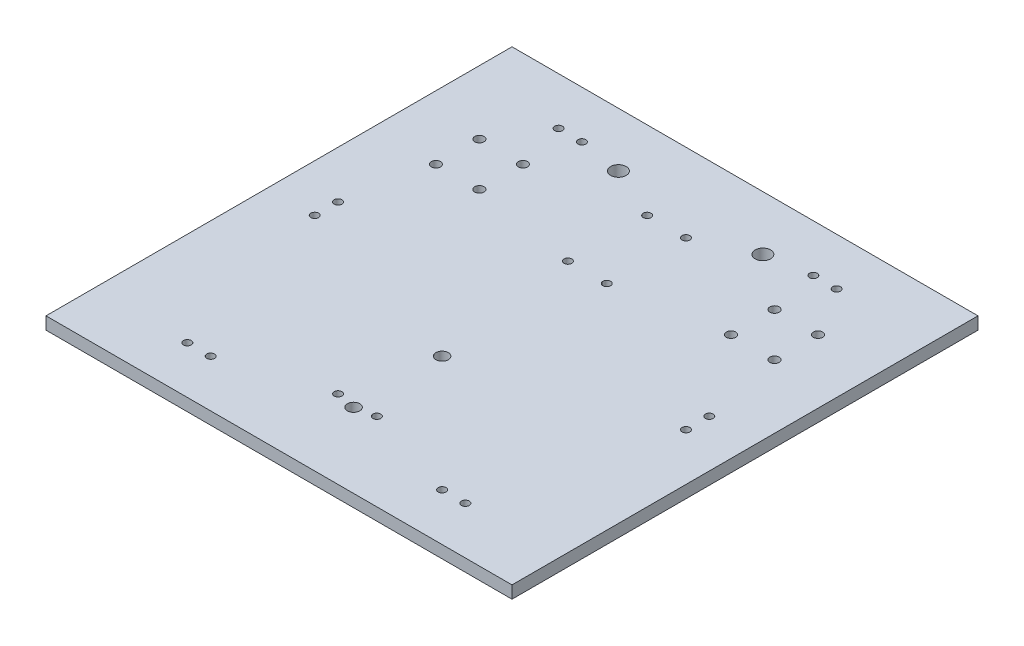
ISO-10303-21;
HEADER;
FILE_DESCRIPTION(('STEP AP214'),'2;1');
FILE_NAME('part.step','',(''),(''),'','','');
FILE_SCHEMA(('AUTOMOTIVE_DESIGN { 1 0 10303 214 1 1 1 1 }'));
ENDSEC;
DATA;
#1=APPLICATION_CONTEXT('core data for automotive mechanical design processes');
#2=APPLICATION_PROTOCOL_DEFINITION('international standard','automotive_design',2000,#1);
#3=PRODUCT_CONTEXT('',#1,'mechanical');
#4=PRODUCT('Part','Part','',(#3));
#5=PRODUCT_RELATED_PRODUCT_CATEGORY('part','',(#4));
#6=PRODUCT_DEFINITION_FORMATION('','',#4);
#7=PRODUCT_DEFINITION_CONTEXT('part definition',#1,'design');
#8=PRODUCT_DEFINITION('design','',#6,#7);
#9=PRODUCT_DEFINITION_SHAPE('','',#8);
#10=(LENGTH_UNIT() NAMED_UNIT(*) SI_UNIT(.MILLI.,.METRE.));
#11=(NAMED_UNIT(*) PLANE_ANGLE_UNIT() SI_UNIT($,.RADIAN.));
#12=(NAMED_UNIT(*) SI_UNIT($,.STERADIAN.) SOLID_ANGLE_UNIT());
#13=UNCERTAINTY_MEASURE_WITH_UNIT(LENGTH_MEASURE(1.E-05),#10,'distance_accuracy_value','');
#14=(GEOMETRIC_REPRESENTATION_CONTEXT(3) GLOBAL_UNCERTAINTY_ASSIGNED_CONTEXT((#13)) GLOBAL_UNIT_ASSIGNED_CONTEXT((#10,
#11,#12)) REPRESENTATION_CONTEXT('',''));
#15=CARTESIAN_POINT('',(0.,0.,0.));
#16=DIRECTION('',(0.,0.,1.));
#17=DIRECTION('',(1.,0.,0.));
#18=AXIS2_PLACEMENT_3D('',#15,#16,#17);
#19=CARTESIAN_POINT('',(-150.,8.,150.));
#20=DIRECTION('',(1.,0.,0.));
#21=DIRECTION('',(0.,0.,-1.));
#22=AXIS2_PLACEMENT_3D('',#19,#20,#21);
#23=PLANE('',#22);
#24=DIRECTION('',(0.,0.,1.));
#25=VECTOR('',#24,1.);
#26=CARTESIAN_POINT('',(-150.,0.,150.));
#27=LINE('',#26,#25);
#28=CARTESIAN_POINT('',(-150.,0.,-150.));
#29=VERTEX_POINT('',#28);
#30=CARTESIAN_POINT('',(-150.,0.,150.));
#31=VERTEX_POINT('',#30);
#32=EDGE_CURVE('E102',#29,#31,#27,.T.);
#33=ORIENTED_EDGE('',*,*,#32,.T.);
#34=DIRECTION('',(0.,-1.,0.));
#35=VECTOR('',#34,1.);
#36=CARTESIAN_POINT('',(-150.,8.,150.));
#37=LINE('',#36,#35);
#38=CARTESIAN_POINT('',(-150.,8.,150.));
#39=VERTEX_POINT('',#38);
#40=EDGE_CURVE('E11',#39,#31,#37,.T.);
#41=ORIENTED_EDGE('',*,*,#40,.F.);
#42=DIRECTION('',(0.,0.,1.));
#43=VECTOR('',#42,1.);
#44=CARTESIAN_POINT('',(-150.,8.,150.));
#45=LINE('',#44,#43);
#46=CARTESIAN_POINT('',(-150.,8.,-150.));
#47=VERTEX_POINT('',#46);
#48=EDGE_CURVE('E89',#47,#39,#45,.T.);
#49=ORIENTED_EDGE('',*,*,#48,.F.);
#50=DIRECTION('',(0.,-1.,0.));
#51=VECTOR('',#50,1.);
#52=CARTESIAN_POINT('',(-150.,8.,-150.));
#53=LINE('',#52,#51);
#54=EDGE_CURVE('E98',#47,#29,#53,.T.);
#55=ORIENTED_EDGE('',*,*,#54,.T.);
#56=EDGE_LOOP('',(#33,#41,#49,#55));
#57=FACE_BOUND('',#56,.T.);
#58=ADVANCED_FACE('F36',(#57),#23,.F.);
#59=CARTESIAN_POINT('',(150.,8.,150.));
#60=DIRECTION('',(0.,0.,-1.));
#61=DIRECTION('',(-1.,0.,0.));
#62=AXIS2_PLACEMENT_3D('',#59,#60,#61);
#63=PLANE('',#62);
#64=DIRECTION('',(1.,0.,0.));
#65=VECTOR('',#64,1.);
#66=CARTESIAN_POINT('',(150.,0.,150.));
#67=LINE('',#66,#65);
#68=CARTESIAN_POINT('',(150.,0.,150.));
#69=VERTEX_POINT('',#68);
#70=EDGE_CURVE('E93',#31,#69,#67,.T.);
#71=ORIENTED_EDGE('',*,*,#70,.T.);
#72=DIRECTION('',(0.,-1.,0.));
#73=VECTOR('',#72,1.);
#74=CARTESIAN_POINT('',(150.,8.,150.));
#75=LINE('',#74,#73);
#76=CARTESIAN_POINT('',(150.,8.,150.));
#77=VERTEX_POINT('',#76);
#78=EDGE_CURVE('E45',#77,#69,#75,.T.);
#79=ORIENTED_EDGE('',*,*,#78,.F.);
#80=DIRECTION('',(1.,0.,0.));
#81=VECTOR('',#80,1.);
#82=CARTESIAN_POINT('',(150.,8.,150.));
#83=LINE('',#82,#81);
#84=EDGE_CURVE('E84',#39,#77,#83,.T.);
#85=ORIENTED_EDGE('',*,*,#84,.F.);
#86=ORIENTED_EDGE('',*,*,#40,.T.);
#87=EDGE_LOOP('',(#71,#79,#85,#86));
#88=FACE_BOUND('',#87,.T.);
#89=ADVANCED_FACE('F92',(#88),#63,.F.);
#90=CARTESIAN_POINT('',(150.,8.,150.));
#91=DIRECTION('',(-1.,0.,0.));
#92=DIRECTION('',(0.,0.,1.));
#93=AXIS2_PLACEMENT_3D('',#90,#91,#92);
#94=PLANE('',#93);
#95=DIRECTION('',(0.,0.,-1.));
#96=VECTOR('',#95,1.);
#97=CARTESIAN_POINT('',(150.,0.,150.));
#98=LINE('',#97,#96);
#99=CARTESIAN_POINT('',(150.,0.,-150.));
#100=VERTEX_POINT('',#99);
#101=EDGE_CURVE('E71',#69,#100,#98,.T.);
#102=ORIENTED_EDGE('',*,*,#101,.T.);
#103=DIRECTION('',(0.,-1.,0.));
#104=VECTOR('',#103,1.);
#105=CARTESIAN_POINT('',(150.,8.,-150.));
#106=LINE('',#105,#104);
#107=CARTESIAN_POINT('',(150.,8.,-150.));
#108=VERTEX_POINT('',#107);
#109=EDGE_CURVE('E94',#108,#100,#106,.T.);
#110=ORIENTED_EDGE('',*,*,#109,.F.);
#111=DIRECTION('',(0.,0.,-1.));
#112=VECTOR('',#111,1.);
#113=CARTESIAN_POINT('',(150.,8.,150.));
#114=LINE('',#113,#112);
#115=EDGE_CURVE('E87',#77,#108,#114,.T.);
#116=ORIENTED_EDGE('',*,*,#115,.F.);
#117=ORIENTED_EDGE('',*,*,#78,.T.);
#118=EDGE_LOOP('',(#102,#110,#116,#117));
#119=FACE_BOUND('',#118,.T.);
#120=ADVANCED_FACE('F96',(#119),#94,.F.);
#121=CARTESIAN_POINT('',(150.,8.,-150.));
#122=DIRECTION('',(0.,0.,1.));
#123=DIRECTION('',(1.,0.,0.));
#124=AXIS2_PLACEMENT_3D('',#121,#122,#123);
#125=PLANE('',#124);
#126=DIRECTION('',(-1.,0.,0.));
#127=VECTOR('',#126,1.);
#128=CARTESIAN_POINT('',(150.,0.,-150.));
#129=LINE('',#128,#127);
#130=EDGE_CURVE('E77',#100,#29,#129,.T.);
#131=ORIENTED_EDGE('',*,*,#130,.T.);
#132=ORIENTED_EDGE('',*,*,#54,.F.);
#133=DIRECTION('',(-1.,0.,0.));
#134=VECTOR('',#133,1.);
#135=CARTESIAN_POINT('',(150.,8.,-150.));
#136=LINE('',#135,#134);
#137=EDGE_CURVE('E54',#108,#47,#136,.T.);
#138=ORIENTED_EDGE('',*,*,#137,.F.);
#139=ORIENTED_EDGE('',*,*,#109,.T.);
#140=EDGE_LOOP('',(#131,#132,#138,#139));
#141=FACE_BOUND('',#140,.T.);
#142=ADVANCED_FACE('F265',(#141),#125,.F.);
#143=CARTESIAN_POINT('',(0.,8.,0.));
#144=DIRECTION('',(0.,1.,0.));
#145=DIRECTION('',(0.,0.,1.));
#146=AXIS2_PLACEMENT_3D('',#143,#144,#145);
#147=PLANE('',#146);
#148=CARTESIAN_POINT('',(-12.5000000000002,8.,99.5));
#149=DIRECTION('',(0.,-1.,0.));
#150=DIRECTION('',(0.,0.,-1.));
#151=AXIS2_PLACEMENT_3D('',#148,#149,#150);
#152=CIRCLE('',#151,2.5);
#153=CARTESIAN_POINT('',(-12.5000000000002,8.,97.));
#154=VERTEX_POINT('',#153);
#155=EDGE_CURVE('E610',#154,#154,#152,.T.);
#156=ORIENTED_EDGE('',*,*,#155,.T.);
#157=EDGE_LOOP('',(#156));
#158=FACE_BOUND('',#157,.T.);
#159=CARTESIAN_POINT('',(12.4999999999999,8.,99.5));
#160=DIRECTION('',(0.,-1.,0.));
#161=DIRECTION('',(0.,0.,-1.));
#162=AXIS2_PLACEMENT_3D('',#159,#160,#161);
#163=CIRCLE('',#162,2.5);
#164=CARTESIAN_POINT('',(12.4999999999999,8.,97.));
#165=VERTEX_POINT('',#164);
#166=EDGE_CURVE('E612',#165,#165,#163,.T.);
#167=ORIENTED_EDGE('',*,*,#166,.T.);
#168=EDGE_LOOP('',(#167));
#169=FACE_BOUND('',#168,.T.);
#170=CARTESIAN_POINT('',(12.4999999999999,8.,-48.5));
#171=DIRECTION('',(0.,1.,0.));
#172=DIRECTION('',(0.,0.,1.));
#173=AXIS2_PLACEMENT_3D('',#170,#171,#172);
#174=CIRCLE('',#173,2.5);
#175=CARTESIAN_POINT('',(12.4999999999999,8.,-46.));
#176=VERTEX_POINT('',#175);
#177=EDGE_CURVE('E618',#176,#176,#174,.T.);
#178=ORIENTED_EDGE('',*,*,#177,.F.);
#179=EDGE_LOOP('',(#178));
#180=FACE_BOUND('',#179,.T.);
#181=CARTESIAN_POINT('',(-12.5000000000001,8.,-48.5));
#182=DIRECTION('',(0.,1.,0.));
#183=DIRECTION('',(0.,0.,1.));
#184=AXIS2_PLACEMENT_3D('',#181,#182,#183);
#185=CIRCLE('',#184,2.5);
#186=CARTESIAN_POINT('',(-12.5000000000001,8.,-46.));
#187=VERTEX_POINT('',#186);
#188=EDGE_CURVE('E624',#187,#187,#185,.T.);
#189=ORIENTED_EDGE('',*,*,#188,.F.);
#190=EDGE_LOOP('',(#189));
#191=FACE_BOUND('',#190,.T.);
#192=CARTESIAN_POINT('',(-12.5000000000002,8.,-99.5));
#193=DIRECTION('',(0.,1.,0.));
#194=DIRECTION('',(0.,0.,1.));
#195=AXIS2_PLACEMENT_3D('',#192,#193,#194);
#196=CIRCLE('',#195,2.5);
#197=CARTESIAN_POINT('',(-12.5000000000002,8.,-97.));
#198=VERTEX_POINT('',#197);
#199=EDGE_CURVE('E630',#198,#198,#196,.T.);
#200=ORIENTED_EDGE('',*,*,#199,.F.);
#201=EDGE_LOOP('',(#200));
#202=FACE_BOUND('',#201,.T.);
#203=CARTESIAN_POINT('',(12.4999999999999,8.,-99.5));
#204=DIRECTION('',(0.,1.,0.));
#205=DIRECTION('',(0.,0.,1.));
#206=AXIS2_PLACEMENT_3D('',#203,#204,#205);
#207=CIRCLE('',#206,2.5);
#208=CARTESIAN_POINT('',(12.4999999999999,8.,-97.));
#209=VERTEX_POINT('',#208);
#210=EDGE_CURVE('E636',#209,#209,#207,.T.);
#211=ORIENTED_EDGE('',*,*,#210,.F.);
#212=EDGE_LOOP('',(#211));
#213=FACE_BOUND('',#212,.T.);
#214=CARTESIAN_POINT('',(46.5,8.00000000000012,-115.));
#215=DIRECTION('',(0.,-1.,0.));
#216=DIRECTION('',(1.,0.,0.));
#217=AXIS2_PLACEMENT_3D('',#214,#215,#216);
#218=CIRCLE('',#217,5.);
#219=CARTESIAN_POINT('',(51.5,8.00000000000012,-115.));
#220=VERTEX_POINT('',#219);
#221=EDGE_CURVE('E165',#220,#220,#218,.T.);
#222=ORIENTED_EDGE('',*,*,#221,.T.);
#223=EDGE_LOOP('',(#222));
#224=FACE_BOUND('',#223,.T.);
#225=CARTESIAN_POINT('',(81.,8.0000000000001,-88.));
#226=DIRECTION('',(0.,-1.,0.));
#227=DIRECTION('',(0.,0.,-1.));
#228=AXIS2_PLACEMENT_3D('',#225,#226,#227);
#229=CIRCLE('',#228,3.00000000000001);
#230=CARTESIAN_POINT('',(81.,8.0000000000001,-91.));
#231=VERTEX_POINT('',#230);
#232=EDGE_CURVE('E155',#231,#231,#229,.T.);
#233=ORIENTED_EDGE('',*,*,#232,.T.);
#234=EDGE_LOOP('',(#233));
#235=FACE_BOUND('',#234,.T.);
#236=CARTESIAN_POINT('',(109.,8.0000000000001,-88.));
#237=DIRECTION('',(0.,-1.,0.));
#238=DIRECTION('',(0.,0.,-1.));
#239=AXIS2_PLACEMENT_3D('',#236,#237,#238);
#240=CIRCLE('',#239,3.00000000000001);
#241=CARTESIAN_POINT('',(109.,8.0000000000001,-91.));
#242=VERTEX_POINT('',#241);
#243=EDGE_CURVE('E152',#242,#242,#240,.T.);
#244=ORIENTED_EDGE('',*,*,#243,.T.);
#245=EDGE_LOOP('',(#244));
#246=FACE_BOUND('',#245,.T.);
#247=CARTESIAN_POINT('',(81.,8.0000000000001,-60.0000000000001));
#248=DIRECTION('',(0.,-1.,0.));
#249=DIRECTION('',(0.,0.,-1.));
#250=AXIS2_PLACEMENT_3D('',#247,#248,#249);
#251=CIRCLE('',#250,3.00000000000001);
#252=CARTESIAN_POINT('',(81.,8.0000000000001,-63.0000000000001));
#253=VERTEX_POINT('',#252);
#254=EDGE_CURVE('E149',#253,#253,#251,.T.);
#255=ORIENTED_EDGE('',*,*,#254,.T.);
#256=EDGE_LOOP('',(#255));
#257=FACE_BOUND('',#256,.T.);
#258=CARTESIAN_POINT('',(109.,8.0000000000001,-60.));
#259=DIRECTION('',(0.,-1.,0.));
#260=DIRECTION('',(0.,0.,-1.));
#261=AXIS2_PLACEMENT_3D('',#258,#259,#260);
#262=CIRCLE('',#261,3.00000000000001);
#263=CARTESIAN_POINT('',(109.,8.0000000000001,-63.));
#264=VERTEX_POINT('',#263);
#265=EDGE_CURVE('E145',#264,#264,#262,.T.);
#266=ORIENTED_EDGE('',*,*,#265,.T.);
#267=EDGE_LOOP('',(#266));
#268=FACE_BOUND('',#267,.T.);
#269=CARTESIAN_POINT('',(119.5,8.,7.49999999999994));
#270=DIRECTION('',(0.,1.,0.));
#271=DIRECTION('',(0.,0.,1.));
#272=AXIS2_PLACEMENT_3D('',#269,#270,#271);
#273=CIRCLE('',#272,2.5);
#274=CARTESIAN_POINT('',(119.5,8.,9.99999999999994));
#275=VERTEX_POINT('',#274);
#276=EDGE_CURVE('E175',#275,#275,#273,.T.);
#277=ORIENTED_EDGE('',*,*,#276,.F.);
#278=EDGE_LOOP('',(#277));
#279=FACE_BOUND('',#278,.T.);
#280=CARTESIAN_POINT('',(119.5,8.,-7.50000000000005));
#281=DIRECTION('',(0.,1.,0.));
#282=DIRECTION('',(0.,0.,1.));
#283=AXIS2_PLACEMENT_3D('',#280,#281,#282);
#284=CIRCLE('',#283,2.5);
#285=CARTESIAN_POINT('',(119.5,8.,-5.00000000000006));
#286=VERTEX_POINT('',#285);
#287=EDGE_CURVE('E181',#286,#286,#284,.T.);
#288=ORIENTED_EDGE('',*,*,#287,.F.);
#289=EDGE_LOOP('',(#288));
#290=FACE_BOUND('',#289,.T.);
#291=CARTESIAN_POINT('',(74.4999999999999,8.,119.5));
#292=DIRECTION('',(0.,1.,0.));
#293=DIRECTION('',(0.,0.,1.));
#294=AXIS2_PLACEMENT_3D('',#291,#292,#293);
#295=CIRCLE('',#294,2.5);
#296=CARTESIAN_POINT('',(74.4999999999999,8.,122.));
#297=VERTEX_POINT('',#296);
#298=EDGE_CURVE('E187',#297,#297,#295,.T.);
#299=ORIENTED_EDGE('',*,*,#298,.F.);
#300=EDGE_LOOP('',(#299));
#301=FACE_BOUND('',#300,.T.);
#302=CARTESIAN_POINT('',(89.4999999999999,8.,119.5));
#303=DIRECTION('',(0.,1.,0.));
#304=DIRECTION('',(0.,0.,1.));
#305=AXIS2_PLACEMENT_3D('',#302,#303,#304);
#306=CIRCLE('',#305,2.50000000000001);
#307=CARTESIAN_POINT('',(89.4999999999999,8.,122.));
#308=VERTEX_POINT('',#307);
#309=EDGE_CURVE('E193',#308,#308,#306,.T.);
#310=ORIENTED_EDGE('',*,*,#309,.F.);
#311=EDGE_LOOP('',(#310));
#312=FACE_BOUND('',#311,.T.);
#313=CARTESIAN_POINT('',(74.4999999999998,8.,-119.5));
#314=DIRECTION('',(0.,1.,0.));
#315=DIRECTION('',(0.,0.,1.));
#316=AXIS2_PLACEMENT_3D('',#313,#314,#315);
#317=CIRCLE('',#316,2.5);
#318=CARTESIAN_POINT('',(74.4999999999998,8.,-117.));
#319=VERTEX_POINT('',#318);
#320=EDGE_CURVE('E199',#319,#319,#317,.T.);
#321=ORIENTED_EDGE('',*,*,#320,.F.);
#322=EDGE_LOOP('',(#321));
#323=FACE_BOUND('',#322,.T.);
#324=CARTESIAN_POINT('',(89.4999999999998,8.,-119.5));
#325=DIRECTION('',(0.,1.,0.));
#326=DIRECTION('',(0.,0.,1.));
#327=AXIS2_PLACEMENT_3D('',#324,#325,#326);
#328=CIRCLE('',#327,2.50000000000001);
#329=CARTESIAN_POINT('',(89.4999999999998,8.,-117.));
#330=VERTEX_POINT('',#329);
#331=EDGE_CURVE('E205',#330,#330,#328,.T.);
#332=ORIENTED_EDGE('',*,*,#331,.F.);
#333=EDGE_LOOP('',(#332));
#334=FACE_BOUND('',#333,.T.);
#335=CARTESIAN_POINT('',(-74.5,8.,119.5));
#336=DIRECTION('',(0.,1.,0.));
#337=DIRECTION('',(0.,0.,1.));
#338=AXIS2_PLACEMENT_3D('',#335,#336,#337);
#339=CIRCLE('',#338,2.50000000000001);
#340=CARTESIAN_POINT('',(-74.5,8.,122.));
#341=VERTEX_POINT('',#340);
#342=EDGE_CURVE('E211',#341,#341,#339,.T.);
#343=ORIENTED_EDGE('',*,*,#342,.F.);
#344=EDGE_LOOP('',(#343));
#345=FACE_BOUND('',#344,.T.);
#346=CARTESIAN_POINT('',(-89.5,8.,119.5));
#347=DIRECTION('',(0.,1.,0.));
#348=DIRECTION('',(0.,0.,1.));
#349=AXIS2_PLACEMENT_3D('',#346,#347,#348);
#350=CIRCLE('',#349,2.5);
#351=CARTESIAN_POINT('',(-89.5,8.,122.));
#352=VERTEX_POINT('',#351);
#353=EDGE_CURVE('E140',#352,#352,#350,.T.);
#354=ORIENTED_EDGE('',*,*,#353,.F.);
#355=EDGE_LOOP('',(#354));
#356=FACE_BOUND('',#355,.T.);
#357=CARTESIAN_POINT('',(0.,8.,102.));
#358=DIRECTION('',(0.,1.,0.));
#359=DIRECTION('',(0.,0.,1.));
#360=AXIS2_PLACEMENT_3D('',#357,#358,#359);
#361=CIRCLE('',#360,4.);
#362=CARTESIAN_POINT('',(0.,8.,106.));
#363=VERTEX_POINT('',#362);
#364=EDGE_CURVE('E136',#363,#363,#361,.F.);
#365=ORIENTED_EDGE('',*,*,#364,.T.);
#366=EDGE_LOOP('',(#365));
#367=FACE_BOUND('',#366,.T.);
#368=CARTESIAN_POINT('',(0.,8.,45.));
#369=DIRECTION('',(0.,1.,0.));
#370=DIRECTION('',(0.,0.,1.));
#371=AXIS2_PLACEMENT_3D('',#368,#369,#370);
#372=CIRCLE('',#371,4.);
#373=CARTESIAN_POINT('',(0.,8.,49.));
#374=VERTEX_POINT('',#373);
#375=EDGE_CURVE('E135',#374,#374,#372,.F.);
#376=ORIENTED_EDGE('',*,*,#375,.T.);
#377=EDGE_LOOP('',(#376));
#378=FACE_BOUND('',#377,.T.);
#379=CARTESIAN_POINT('',(-46.5,8.0000000000001,-115.));
#380=DIRECTION('',(0.,-1.,0.));
#381=DIRECTION('',(0.,0.,-1.));
#382=AXIS2_PLACEMENT_3D('',#379,#380,#381);
#383=CIRCLE('',#382,5.);
#384=CARTESIAN_POINT('',(-46.5,8.00000000000011,-120.));
#385=VERTEX_POINT('',#384);
#386=EDGE_CURVE('E131',#385,#385,#383,.T.);
#387=ORIENTED_EDGE('',*,*,#386,.T.);
#388=EDGE_LOOP('',(#387));
#389=FACE_BOUND('',#388,.T.);
#390=CARTESIAN_POINT('',(-81.,8.,-60.));
#391=DIRECTION('',(0.,-1.,0.));
#392=DIRECTION('',(0.,0.,-1.));
#393=AXIS2_PLACEMENT_3D('',#390,#391,#392);
#394=CIRCLE('',#393,3.00000000000001);
#395=CARTESIAN_POINT('',(-81.,8.,-63.));
#396=VERTEX_POINT('',#395);
#397=EDGE_CURVE('E127',#396,#396,#394,.T.);
#398=ORIENTED_EDGE('',*,*,#397,.T.);
#399=EDGE_LOOP('',(#398));
#400=FACE_BOUND('',#399,.T.);
#401=CARTESIAN_POINT('',(-81.,8.,-88.));
#402=DIRECTION('',(0.,-1.,0.));
#403=DIRECTION('',(0.,0.,-1.));
#404=AXIS2_PLACEMENT_3D('',#401,#402,#403);
#405=CIRCLE('',#404,3.00000000000001);
#406=CARTESIAN_POINT('',(-81.,8.,-91.));
#407=VERTEX_POINT('',#406);
#408=EDGE_CURVE('E123',#407,#407,#405,.T.);
#409=ORIENTED_EDGE('',*,*,#408,.T.);
#410=EDGE_LOOP('',(#409));
#411=FACE_BOUND('',#410,.T.);
#412=CARTESIAN_POINT('',(-109.,8.,-60.0000000000001));
#413=DIRECTION('',(0.,-1.,0.));
#414=DIRECTION('',(0.,0.,-1.));
#415=AXIS2_PLACEMENT_3D('',#412,#413,#414);
#416=CIRCLE('',#415,3.00000000000001);
#417=CARTESIAN_POINT('',(-109.,8.,-63.0000000000001));
#418=VERTEX_POINT('',#417);
#419=EDGE_CURVE('E119',#418,#418,#416,.T.);
#420=ORIENTED_EDGE('',*,*,#419,.T.);
#421=EDGE_LOOP('',(#420));
#422=FACE_BOUND('',#421,.T.);
#423=CARTESIAN_POINT('',(-109.,8.,-88.));
#424=DIRECTION('',(0.,-1.,0.));
#425=DIRECTION('',(0.,0.,-1.));
#426=AXIS2_PLACEMENT_3D('',#423,#424,#425);
#427=CIRCLE('',#426,3.00000000000001);
#428=CARTESIAN_POINT('',(-109.,8.,-91.));
#429=VERTEX_POINT('',#428);
#430=EDGE_CURVE('E115',#429,#429,#427,.T.);
#431=ORIENTED_EDGE('',*,*,#430,.T.);
#432=EDGE_LOOP('',(#431));
#433=FACE_BOUND('',#432,.T.);
#434=CARTESIAN_POINT('',(-74.5,8.,-119.5));
#435=DIRECTION('',(0.,-1.,0.));
#436=DIRECTION('',(0.,0.,-1.));
#437=AXIS2_PLACEMENT_3D('',#434,#435,#436);
#438=CIRCLE('',#437,2.5);
#439=CARTESIAN_POINT('',(-74.5,8.,-122.));
#440=VERTEX_POINT('',#439);
#441=EDGE_CURVE('E233',#440,#440,#438,.T.);
#442=ORIENTED_EDGE('',*,*,#441,.T.);
#443=EDGE_LOOP('',(#442));
#444=FACE_BOUND('',#443,.T.);
#445=CARTESIAN_POINT('',(-89.5,8.,-119.5));
#446=DIRECTION('',(0.,-1.,0.));
#447=DIRECTION('',(0.,0.,-1.));
#448=AXIS2_PLACEMENT_3D('',#445,#446,#447);
#449=CIRCLE('',#448,2.50000000000001);
#450=CARTESIAN_POINT('',(-89.5,8.,-122.));
#451=VERTEX_POINT('',#450);
#452=EDGE_CURVE('E239',#451,#451,#449,.T.);
#453=ORIENTED_EDGE('',*,*,#452,.T.);
#454=EDGE_LOOP('',(#453));
#455=FACE_BOUND('',#454,.T.);
#456=CARTESIAN_POINT('',(-119.5,8.,7.49999999999998));
#457=DIRECTION('',(0.,-1.,0.));
#458=DIRECTION('',(0.,0.,-1.));
#459=AXIS2_PLACEMENT_3D('',#456,#457,#458);
#460=CIRCLE('',#459,2.50000000000001);
#461=CARTESIAN_POINT('',(-119.5,8.,4.99999999999997));
#462=VERTEX_POINT('',#461);
#463=EDGE_CURVE('E245',#462,#462,#460,.T.);
#464=ORIENTED_EDGE('',*,*,#463,.T.);
#465=EDGE_LOOP('',(#464));
#466=FACE_BOUND('',#465,.T.);
#467=CARTESIAN_POINT('',(-119.5,8.,-7.50000000000001));
#468=DIRECTION('',(0.,-1.,0.));
#469=DIRECTION('',(0.,0.,-1.));
#470=AXIS2_PLACEMENT_3D('',#467,#468,#469);
#471=CIRCLE('',#470,2.49999999999999);
#472=CARTESIAN_POINT('',(-119.5,8.,-10.));
#473=VERTEX_POINT('',#472);
#474=EDGE_CURVE('E105',#473,#473,#471,.T.);
#475=ORIENTED_EDGE('',*,*,#474,.T.);
#476=EDGE_LOOP('',(#475));
#477=FACE_BOUND('',#476,.T.);
#478=ORIENTED_EDGE('',*,*,#48,.T.);
#479=ORIENTED_EDGE('',*,*,#84,.T.);
#480=ORIENTED_EDGE('',*,*,#115,.T.);
#481=ORIENTED_EDGE('',*,*,#137,.T.);
#482=EDGE_LOOP('',(#478,#479,#480,#481));
#483=FACE_BOUND('',#482,.T.);
#484=ADVANCED_FACE('F85',(#158,#169,#180,#191,#202,#213,#224,#235,#246,#257,#268,#279,#290,#301,
#312,#323,#334,#345,#356,#367,#378,#389,#400,#411,#422,#433,#444,#455,#466,#477,#483),#147,.T.);
#485=CARTESIAN_POINT('',(0.,0.,0.));
#486=DIRECTION('',(0.,1.,0.));
#487=DIRECTION('',(0.,0.,1.));
#488=AXIS2_PLACEMENT_3D('',#485,#486,#487);
#489=PLANE('',#488);
#490=CARTESIAN_POINT('',(-12.5000000000002,0.,99.5));
#491=DIRECTION('',(0.,-1.,0.));
#492=DIRECTION('',(0.,0.,-1.));
#493=AXIS2_PLACEMENT_3D('',#490,#491,#492);
#494=CIRCLE('',#493,2.5);
#495=CARTESIAN_POINT('',(-12.5000000000002,0.,97.));
#496=VERTEX_POINT('',#495);
#497=EDGE_CURVE('E607',#496,#496,#494,.T.);
#498=ORIENTED_EDGE('',*,*,#497,.F.);
#499=EDGE_LOOP('',(#498));
#500=FACE_BOUND('',#499,.T.);
#501=CARTESIAN_POINT('',(12.4999999999999,0.,99.5));
#502=DIRECTION('',(0.,-1.,0.));
#503=DIRECTION('',(0.,0.,-1.));
#504=AXIS2_PLACEMENT_3D('',#501,#502,#503);
#505=CIRCLE('',#504,2.5);
#506=CARTESIAN_POINT('',(12.4999999999999,0.,97.));
#507=VERTEX_POINT('',#506);
#508=EDGE_CURVE('E615',#507,#507,#505,.T.);
#509=ORIENTED_EDGE('',*,*,#508,.F.);
#510=EDGE_LOOP('',(#509));
#511=FACE_BOUND('',#510,.T.);
#512=CARTESIAN_POINT('',(12.4999999999999,0.,-48.5));
#513=DIRECTION('',(0.,1.,0.));
#514=DIRECTION('',(0.,0.,1.));
#515=AXIS2_PLACEMENT_3D('',#512,#513,#514);
#516=CIRCLE('',#515,2.5);
#517=CARTESIAN_POINT('',(12.4999999999999,0.,-46.));
#518=VERTEX_POINT('',#517);
#519=EDGE_CURVE('E621',#518,#518,#516,.T.);
#520=ORIENTED_EDGE('',*,*,#519,.T.);
#521=EDGE_LOOP('',(#520));
#522=FACE_BOUND('',#521,.T.);
#523=CARTESIAN_POINT('',(-12.5000000000001,0.,-48.5));
#524=DIRECTION('',(0.,1.,0.));
#525=DIRECTION('',(0.,0.,1.));
#526=AXIS2_PLACEMENT_3D('',#523,#524,#525);
#527=CIRCLE('',#526,2.5);
#528=CARTESIAN_POINT('',(-12.5000000000001,0.,-46.));
#529=VERTEX_POINT('',#528);
#530=EDGE_CURVE('E627',#529,#529,#527,.T.);
#531=ORIENTED_EDGE('',*,*,#530,.T.);
#532=EDGE_LOOP('',(#531));
#533=FACE_BOUND('',#532,.T.);
#534=CARTESIAN_POINT('',(-12.5000000000002,0.,-99.5));
#535=DIRECTION('',(0.,1.,0.));
#536=DIRECTION('',(0.,0.,1.));
#537=AXIS2_PLACEMENT_3D('',#534,#535,#536);
#538=CIRCLE('',#537,2.5);
#539=CARTESIAN_POINT('',(-12.5000000000002,0.,-97.));
#540=VERTEX_POINT('',#539);
#541=EDGE_CURVE('E633',#540,#540,#538,.T.);
#542=ORIENTED_EDGE('',*,*,#541,.T.);
#543=EDGE_LOOP('',(#542));
#544=FACE_BOUND('',#543,.T.);
#545=CARTESIAN_POINT('',(12.4999999999999,0.,-99.5));
#546=DIRECTION('',(0.,1.,0.));
#547=DIRECTION('',(0.,0.,1.));
#548=AXIS2_PLACEMENT_3D('',#545,#546,#547);
#549=CIRCLE('',#548,2.5);
#550=CARTESIAN_POINT('',(12.4999999999999,0.,-97.));
#551=VERTEX_POINT('',#550);
#552=EDGE_CURVE('E639',#551,#551,#549,.T.);
#553=ORIENTED_EDGE('',*,*,#552,.T.);
#554=EDGE_LOOP('',(#553));
#555=FACE_BOUND('',#554,.T.);
#556=CARTESIAN_POINT('',(46.5,0.,-115.));
#557=DIRECTION('',(0.,1.,0.));
#558=DIRECTION('',(0.,0.,1.));
#559=AXIS2_PLACEMENT_3D('',#556,#557,#558);
#560=CIRCLE('',#559,5.);
#561=CARTESIAN_POINT('',(46.5,0.,-110.));
#562=VERTEX_POINT('',#561);
#563=EDGE_CURVE('E39',#562,#562,#560,.T.);
#564=ORIENTED_EDGE('',*,*,#563,.T.);
#565=EDGE_LOOP('',(#564));
#566=FACE_BOUND('',#565,.T.);
#567=CARTESIAN_POINT('',(81.,0.,-88.));
#568=DIRECTION('',(0.,1.,0.));
#569=DIRECTION('',(0.,0.,1.));
#570=AXIS2_PLACEMENT_3D('',#567,#568,#569);
#571=CIRCLE('',#570,3.00000000000001);
#572=CARTESIAN_POINT('',(81.,0.,-85.));
#573=VERTEX_POINT('',#572);
#574=EDGE_CURVE('E153',#573,#573,#571,.T.);
#575=ORIENTED_EDGE('',*,*,#574,.T.);
#576=EDGE_LOOP('',(#575));
#577=FACE_BOUND('',#576,.T.);
#578=CARTESIAN_POINT('',(109.,0.,-88.));
#579=DIRECTION('',(0.,1.,0.));
#580=DIRECTION('',(0.,0.,1.));
#581=AXIS2_PLACEMENT_3D('',#578,#579,#580);
#582=CIRCLE('',#581,3.00000000000001);
#583=CARTESIAN_POINT('',(109.,0.,-85.));
#584=VERTEX_POINT('',#583);
#585=EDGE_CURVE('E150',#584,#584,#582,.T.);
#586=ORIENTED_EDGE('',*,*,#585,.T.);
#587=EDGE_LOOP('',(#586));
#588=FACE_BOUND('',#587,.T.);
#589=CARTESIAN_POINT('',(81.,0.,-60.0000000000001));
#590=DIRECTION('',(0.,1.,0.));
#591=DIRECTION('',(0.,0.,1.));
#592=AXIS2_PLACEMENT_3D('',#589,#590,#591);
#593=CIRCLE('',#592,3.00000000000001);
#594=CARTESIAN_POINT('',(81.,0.,-57.));
#595=VERTEX_POINT('',#594);
#596=EDGE_CURVE('E146',#595,#595,#593,.T.);
#597=ORIENTED_EDGE('',*,*,#596,.T.);
#598=EDGE_LOOP('',(#597));
#599=FACE_BOUND('',#598,.T.);
#600=CARTESIAN_POINT('',(109.,0.,-60.));
#601=DIRECTION('',(0.,1.,0.));
#602=DIRECTION('',(0.,0.,1.));
#603=AXIS2_PLACEMENT_3D('',#600,#601,#602);
#604=CIRCLE('',#603,3.00000000000001);
#605=CARTESIAN_POINT('',(109.,0.,-57.));
#606=VERTEX_POINT('',#605);
#607=EDGE_CURVE('E141',#606,#606,#604,.T.);
#608=ORIENTED_EDGE('',*,*,#607,.T.);
#609=EDGE_LOOP('',(#608));
#610=FACE_BOUND('',#609,.T.);
#611=CARTESIAN_POINT('',(119.5,0.,7.49999999999994));
#612=DIRECTION('',(0.,-1.,0.));
#613=DIRECTION('',(0.,0.,-1.));
#614=AXIS2_PLACEMENT_3D('',#611,#612,#613);
#615=CIRCLE('',#614,2.5);
#616=CARTESIAN_POINT('',(119.5,0.,4.99999999999995));
#617=VERTEX_POINT('',#616);
#618=EDGE_CURVE('E144',#617,#617,#615,.T.);
#619=ORIENTED_EDGE('',*,*,#618,.F.);
#620=EDGE_LOOP('',(#619));
#621=FACE_BOUND('',#620,.T.);
#622=CARTESIAN_POINT('',(119.5,0.,-7.50000000000005));
#623=DIRECTION('',(0.,-1.,0.));
#624=DIRECTION('',(0.,0.,-1.));
#625=AXIS2_PLACEMENT_3D('',#622,#623,#624);
#626=CIRCLE('',#625,2.5);
#627=CARTESIAN_POINT('',(119.5,0.,-10.));
#628=VERTEX_POINT('',#627);
#629=EDGE_CURVE('E178',#628,#628,#626,.T.);
#630=ORIENTED_EDGE('',*,*,#629,.F.);
#631=EDGE_LOOP('',(#630));
#632=FACE_BOUND('',#631,.T.);
#633=CARTESIAN_POINT('',(74.4999999999999,0.,119.5));
#634=DIRECTION('',(0.,-1.,0.));
#635=DIRECTION('',(0.,0.,-1.));
#636=AXIS2_PLACEMENT_3D('',#633,#634,#635);
#637=CIRCLE('',#636,2.5);
#638=CARTESIAN_POINT('',(74.4999999999999,0.,117.));
#639=VERTEX_POINT('',#638);
#640=EDGE_CURVE('E184',#639,#639,#637,.T.);
#641=ORIENTED_EDGE('',*,*,#640,.F.);
#642=EDGE_LOOP('',(#641));
#643=FACE_BOUND('',#642,.T.);
#644=CARTESIAN_POINT('',(89.4999999999999,0.,119.5));
#645=DIRECTION('',(0.,-1.,0.));
#646=DIRECTION('',(0.,0.,-1.));
#647=AXIS2_PLACEMENT_3D('',#644,#645,#646);
#648=CIRCLE('',#647,2.50000000000001);
#649=CARTESIAN_POINT('',(89.4999999999999,0.,117.));
#650=VERTEX_POINT('',#649);
#651=EDGE_CURVE('E190',#650,#650,#648,.T.);
#652=ORIENTED_EDGE('',*,*,#651,.F.);
#653=EDGE_LOOP('',(#652));
#654=FACE_BOUND('',#653,.T.);
#655=CARTESIAN_POINT('',(74.4999999999998,0.,-119.5));
#656=DIRECTION('',(0.,-1.,0.));
#657=DIRECTION('',(0.,0.,-1.));
#658=AXIS2_PLACEMENT_3D('',#655,#656,#657);
#659=CIRCLE('',#658,2.5);
#660=CARTESIAN_POINT('',(74.4999999999998,0.,-122.));
#661=VERTEX_POINT('',#660);
#662=EDGE_CURVE('E196',#661,#661,#659,.T.);
#663=ORIENTED_EDGE('',*,*,#662,.F.);
#664=EDGE_LOOP('',(#663));
#665=FACE_BOUND('',#664,.T.);
#666=CARTESIAN_POINT('',(89.4999999999998,0.,-119.5));
#667=DIRECTION('',(0.,-1.,0.));
#668=DIRECTION('',(0.,0.,-1.));
#669=AXIS2_PLACEMENT_3D('',#666,#667,#668);
#670=CIRCLE('',#669,2.50000000000001);
#671=CARTESIAN_POINT('',(89.4999999999998,0.,-122.));
#672=VERTEX_POINT('',#671);
#673=EDGE_CURVE('E202',#672,#672,#670,.T.);
#674=ORIENTED_EDGE('',*,*,#673,.F.);
#675=EDGE_LOOP('',(#674));
#676=FACE_BOUND('',#675,.T.);
#677=CARTESIAN_POINT('',(-74.5,0.,119.5));
#678=DIRECTION('',(0.,-1.,0.));
#679=DIRECTION('',(0.,0.,-1.));
#680=AXIS2_PLACEMENT_3D('',#677,#678,#679);
#681=CIRCLE('',#680,2.50000000000001);
#682=CARTESIAN_POINT('',(-74.5,0.,117.));
#683=VERTEX_POINT('',#682);
#684=EDGE_CURVE('E208',#683,#683,#681,.T.);
#685=ORIENTED_EDGE('',*,*,#684,.F.);
#686=EDGE_LOOP('',(#685));
#687=FACE_BOUND('',#686,.T.);
#688=CARTESIAN_POINT('',(-89.5,0.,119.5));
#689=DIRECTION('',(0.,-1.,0.));
#690=DIRECTION('',(0.,0.,-1.));
#691=AXIS2_PLACEMENT_3D('',#688,#689,#690);
#692=CIRCLE('',#691,2.5);
#693=CARTESIAN_POINT('',(-89.5,0.,117.));
#694=VERTEX_POINT('',#693);
#695=EDGE_CURVE('E214',#694,#694,#692,.T.);
#696=ORIENTED_EDGE('',*,*,#695,.F.);
#697=EDGE_LOOP('',(#696));
#698=FACE_BOUND('',#697,.T.);
#699=CARTESIAN_POINT('',(0.,0.,102.));
#700=DIRECTION('',(0.,1.,0.));
#701=DIRECTION('',(0.,0.,1.));
#702=AXIS2_PLACEMENT_3D('',#699,#700,#701);
#703=CIRCLE('',#702,4.);
#704=CARTESIAN_POINT('',(0.,0.,106.));
#705=VERTEX_POINT('',#704);
#706=EDGE_CURVE('E137',#705,#705,#703,.F.);
#707=ORIENTED_EDGE('',*,*,#706,.F.);
#708=EDGE_LOOP('',(#707));
#709=FACE_BOUND('',#708,.T.);
#710=CARTESIAN_POINT('',(0.,0.,45.));
#711=DIRECTION('',(0.,1.,0.));
#712=DIRECTION('',(0.,0.,1.));
#713=AXIS2_PLACEMENT_3D('',#710,#711,#712);
#714=CIRCLE('',#713,4.);
#715=CARTESIAN_POINT('',(0.,0.,49.));
#716=VERTEX_POINT('',#715);
#717=EDGE_CURVE('E132',#716,#716,#714,.F.);
#718=ORIENTED_EDGE('',*,*,#717,.F.);
#719=EDGE_LOOP('',(#718));
#720=FACE_BOUND('',#719,.T.);
#721=CARTESIAN_POINT('',(-46.5,0.,-115.));
#722=DIRECTION('',(0.,1.,0.));
#723=DIRECTION('',(0.,0.,1.));
#724=AXIS2_PLACEMENT_3D('',#721,#722,#723);
#725=CIRCLE('',#724,5.);
#726=CARTESIAN_POINT('',(-46.5,0.,-110.));
#727=VERTEX_POINT('',#726);
#728=EDGE_CURVE('E128',#727,#727,#725,.T.);
#729=ORIENTED_EDGE('',*,*,#728,.T.);
#730=EDGE_LOOP('',(#729));
#731=FACE_BOUND('',#730,.T.);
#732=CARTESIAN_POINT('',(-81.,0.,-60.));
#733=DIRECTION('',(0.,1.,0.));
#734=DIRECTION('',(0.,0.,1.));
#735=AXIS2_PLACEMENT_3D('',#732,#733,#734);
#736=CIRCLE('',#735,3.00000000000001);
#737=CARTESIAN_POINT('',(-81.,0.,-57.));
#738=VERTEX_POINT('',#737);
#739=EDGE_CURVE('E124',#738,#738,#736,.T.);
#740=ORIENTED_EDGE('',*,*,#739,.T.);
#741=EDGE_LOOP('',(#740));
#742=FACE_BOUND('',#741,.T.);
#743=CARTESIAN_POINT('',(-81.,0.,-88.));
#744=DIRECTION('',(0.,1.,0.));
#745=DIRECTION('',(0.,0.,1.));
#746=AXIS2_PLACEMENT_3D('',#743,#744,#745);
#747=CIRCLE('',#746,3.00000000000001);
#748=CARTESIAN_POINT('',(-81.,0.,-85.));
#749=VERTEX_POINT('',#748);
#750=EDGE_CURVE('E120',#749,#749,#747,.T.);
#751=ORIENTED_EDGE('',*,*,#750,.T.);
#752=EDGE_LOOP('',(#751));
#753=FACE_BOUND('',#752,.T.);
#754=CARTESIAN_POINT('',(-109.,0.,-60.0000000000001));
#755=DIRECTION('',(0.,1.,0.));
#756=DIRECTION('',(0.,0.,1.));
#757=AXIS2_PLACEMENT_3D('',#754,#755,#756);
#758=CIRCLE('',#757,3.00000000000001);
#759=CARTESIAN_POINT('',(-109.,0.,-57.));
#760=VERTEX_POINT('',#759);
#761=EDGE_CURVE('E116',#760,#760,#758,.T.);
#762=ORIENTED_EDGE('',*,*,#761,.T.);
#763=EDGE_LOOP('',(#762));
#764=FACE_BOUND('',#763,.T.);
#765=CARTESIAN_POINT('',(-109.,0.,-88.));
#766=DIRECTION('',(0.,1.,0.));
#767=DIRECTION('',(0.,0.,1.));
#768=AXIS2_PLACEMENT_3D('',#765,#766,#767);
#769=CIRCLE('',#768,3.00000000000001);
#770=CARTESIAN_POINT('',(-109.,0.,-85.));
#771=VERTEX_POINT('',#770);
#772=EDGE_CURVE('E111',#771,#771,#769,.T.);
#773=ORIENTED_EDGE('',*,*,#772,.T.);
#774=EDGE_LOOP('',(#773));
#775=FACE_BOUND('',#774,.T.);
#776=CARTESIAN_POINT('',(-74.5,0.,-119.5));
#777=DIRECTION('',(0.,-1.,0.));
#778=DIRECTION('',(0.,0.,-1.));
#779=AXIS2_PLACEMENT_3D('',#776,#777,#778);
#780=CIRCLE('',#779,2.5);
#781=CARTESIAN_POINT('',(-74.5,0.,-122.));
#782=VERTEX_POINT('',#781);
#783=EDGE_CURVE('E114',#782,#782,#780,.T.);
#784=ORIENTED_EDGE('',*,*,#783,.F.);
#785=EDGE_LOOP('',(#784));
#786=FACE_BOUND('',#785,.T.);
#787=CARTESIAN_POINT('',(-89.5,0.,-119.5));
#788=DIRECTION('',(0.,-1.,0.));
#789=DIRECTION('',(0.,0.,-1.));
#790=AXIS2_PLACEMENT_3D('',#787,#788,#789);
#791=CIRCLE('',#790,2.50000000000001);
#792=CARTESIAN_POINT('',(-89.5,0.,-122.));
#793=VERTEX_POINT('',#792);
#794=EDGE_CURVE('E236',#793,#793,#791,.T.);
#795=ORIENTED_EDGE('',*,*,#794,.F.);
#796=EDGE_LOOP('',(#795));
#797=FACE_BOUND('',#796,.T.);
#798=CARTESIAN_POINT('',(-119.5,0.,7.49999999999998));
#799=DIRECTION('',(0.,-1.,0.));
#800=DIRECTION('',(0.,0.,-1.));
#801=AXIS2_PLACEMENT_3D('',#798,#799,#800);
#802=CIRCLE('',#801,2.50000000000001);
#803=CARTESIAN_POINT('',(-119.5,0.,4.99999999999997));
#804=VERTEX_POINT('',#803);
#805=EDGE_CURVE('E242',#804,#804,#802,.T.);
#806=ORIENTED_EDGE('',*,*,#805,.F.);
#807=EDGE_LOOP('',(#806));
#808=FACE_BOUND('',#807,.T.);
#809=CARTESIAN_POINT('',(-119.5,0.,-7.50000000000001));
#810=DIRECTION('',(0.,-1.,0.));
#811=DIRECTION('',(0.,0.,-1.));
#812=AXIS2_PLACEMENT_3D('',#809,#810,#811);
#813=CIRCLE('',#812,2.49999999999999);
#814=CARTESIAN_POINT('',(-119.5,0.,-10.));
#815=VERTEX_POINT('',#814);
#816=EDGE_CURVE('E248',#815,#815,#813,.T.);
#817=ORIENTED_EDGE('',*,*,#816,.F.);
#818=EDGE_LOOP('',(#817));
#819=FACE_BOUND('',#818,.T.);
#820=ORIENTED_EDGE('',*,*,#32,.F.);
#821=ORIENTED_EDGE('',*,*,#130,.F.);
#822=ORIENTED_EDGE('',*,*,#101,.F.);
#823=ORIENTED_EDGE('',*,*,#70,.F.);
#824=EDGE_LOOP('',(#820,#821,#822,#823));
#825=FACE_BOUND('',#824,.T.);
#826=ADVANCED_FACE('F258',(#500,#511,#522,#533,#544,#555,#566,#577,#588,#599,#610,#621,#632,
#643,#654,#665,#676,#687,#698,#709,#720,#731,#742,#753,#764,#775,#786,#797,#808,#819,#825),#489,.F.);
#827=CARTESIAN_POINT('',(-119.5,8.,-7.50000000000001));
#828=DIRECTION('',(0.,-1.,0.));
#829=DIRECTION('',(0.,0.,-1.));
#830=AXIS2_PLACEMENT_3D('',#827,#828,#829);
#831=CYLINDRICAL_SURFACE('',#830,2.49999999999999);
#832=ORIENTED_EDGE('',*,*,#474,.F.);
#833=EDGE_LOOP('',(#832));
#834=FACE_BOUND('',#833,.T.);
#835=ORIENTED_EDGE('',*,*,#816,.T.);
#836=EDGE_LOOP('',(#835));
#837=FACE_BOUND('',#836,.T.);
#838=ADVANCED_FACE('F256',(#834,#837),#831,.F.);
#839=CARTESIAN_POINT('',(-119.5,8.,7.49999999999998));
#840=DIRECTION('',(0.,-1.,0.));
#841=DIRECTION('',(0.,0.,-1.));
#842=AXIS2_PLACEMENT_3D('',#839,#840,#841);
#843=CYLINDRICAL_SURFACE('',#842,2.50000000000001);
#844=ORIENTED_EDGE('',*,*,#463,.F.);
#845=EDGE_LOOP('',(#844));
#846=FACE_BOUND('',#845,.T.);
#847=ORIENTED_EDGE('',*,*,#805,.T.);
#848=EDGE_LOOP('',(#847));
#849=FACE_BOUND('',#848,.T.);
#850=ADVANCED_FACE('F299',(#846,#849),#843,.F.);
#851=CARTESIAN_POINT('',(-89.5,8.,-119.5));
#852=DIRECTION('',(0.,-1.,0.));
#853=DIRECTION('',(0.,0.,-1.));
#854=AXIS2_PLACEMENT_3D('',#851,#852,#853);
#855=CYLINDRICAL_SURFACE('',#854,2.50000000000001);
#856=ORIENTED_EDGE('',*,*,#452,.F.);
#857=EDGE_LOOP('',(#856));
#858=FACE_BOUND('',#857,.T.);
#859=ORIENTED_EDGE('',*,*,#794,.T.);
#860=EDGE_LOOP('',(#859));
#861=FACE_BOUND('',#860,.T.);
#862=ADVANCED_FACE('F310',(#858,#861),#855,.F.);
#863=CARTESIAN_POINT('',(-74.5,8.,-119.5));
#864=DIRECTION('',(0.,-1.,0.));
#865=DIRECTION('',(0.,0.,-1.));
#866=AXIS2_PLACEMENT_3D('',#863,#864,#865);
#867=CYLINDRICAL_SURFACE('',#866,2.5);
#868=ORIENTED_EDGE('',*,*,#441,.F.);
#869=EDGE_LOOP('',(#868));
#870=FACE_BOUND('',#869,.T.);
#871=ORIENTED_EDGE('',*,*,#783,.T.);
#872=EDGE_LOOP('',(#871));
#873=FACE_BOUND('',#872,.T.);
#874=ADVANCED_FACE('F320',(#870,#873),#867,.F.);
#875=CARTESIAN_POINT('',(-109.,8.,-88.));
#876=DIRECTION('',(0.,-1.,0.));
#877=DIRECTION('',(0.,0.,-1.));
#878=AXIS2_PLACEMENT_3D('',#875,#876,#877);
#879=CYLINDRICAL_SURFACE('',#878,3.00000000000001);
#880=ORIENTED_EDGE('',*,*,#430,.F.);
#881=EDGE_LOOP('',(#880));
#882=FACE_BOUND('',#881,.T.);
#883=ORIENTED_EDGE('',*,*,#772,.F.);
#884=EDGE_LOOP('',(#883));
#885=FACE_BOUND('',#884,.T.);
#886=ADVANCED_FACE('F330',(#882,#885),#879,.F.);
#887=CARTESIAN_POINT('',(-109.,8.,-60.0000000000001));
#888=DIRECTION('',(0.,-1.,0.));
#889=DIRECTION('',(0.,0.,-1.));
#890=AXIS2_PLACEMENT_3D('',#887,#888,#889);
#891=CYLINDRICAL_SURFACE('',#890,3.00000000000001);
#892=ORIENTED_EDGE('',*,*,#419,.F.);
#893=EDGE_LOOP('',(#892));
#894=FACE_BOUND('',#893,.T.);
#895=ORIENTED_EDGE('',*,*,#761,.F.);
#896=EDGE_LOOP('',(#895));
#897=FACE_BOUND('',#896,.T.);
#898=ADVANCED_FACE('F340',(#894,#897),#891,.F.);
#899=CARTESIAN_POINT('',(-81.,8.,-88.));
#900=DIRECTION('',(0.,-1.,0.));
#901=DIRECTION('',(0.,0.,-1.));
#902=AXIS2_PLACEMENT_3D('',#899,#900,#901);
#903=CYLINDRICAL_SURFACE('',#902,3.00000000000001);
#904=ORIENTED_EDGE('',*,*,#408,.F.);
#905=EDGE_LOOP('',(#904));
#906=FACE_BOUND('',#905,.T.);
#907=ORIENTED_EDGE('',*,*,#750,.F.);
#908=EDGE_LOOP('',(#907));
#909=FACE_BOUND('',#908,.T.);
#910=ADVANCED_FACE('F350',(#906,#909),#903,.F.);
#911=CARTESIAN_POINT('',(-81.,8.,-60.));
#912=DIRECTION('',(0.,-1.,0.));
#913=DIRECTION('',(0.,0.,-1.));
#914=AXIS2_PLACEMENT_3D('',#911,#912,#913);
#915=CYLINDRICAL_SURFACE('',#914,3.00000000000001);
#916=ORIENTED_EDGE('',*,*,#397,.F.);
#917=EDGE_LOOP('',(#916));
#918=FACE_BOUND('',#917,.T.);
#919=ORIENTED_EDGE('',*,*,#739,.F.);
#920=EDGE_LOOP('',(#919));
#921=FACE_BOUND('',#920,.T.);
#922=ADVANCED_FACE('F360',(#918,#921),#915,.F.);
#923=CARTESIAN_POINT('',(-46.5,8.0000000000001,-115.));
#924=DIRECTION('',(0.,-1.,0.));
#925=DIRECTION('',(0.,0.,-1.));
#926=AXIS2_PLACEMENT_3D('',#923,#924,#925);
#927=CYLINDRICAL_SURFACE('',#926,5.);
#928=ORIENTED_EDGE('',*,*,#386,.F.);
#929=EDGE_LOOP('',(#928));
#930=FACE_BOUND('',#929,.T.);
#931=ORIENTED_EDGE('',*,*,#728,.F.);
#932=EDGE_LOOP('',(#931));
#933=FACE_BOUND('',#932,.T.);
#934=ADVANCED_FACE('F370',(#930,#933),#927,.F.);
#935=CARTESIAN_POINT('',(0.,41.5000000000001,45.));
#936=DIRECTION('',(0.,-1.,0.));
#937=DIRECTION('',(1.,0.,0.));
#938=AXIS2_PLACEMENT_3D('',#935,#936,#937);
#939=CYLINDRICAL_SURFACE('',#938,4.);
#940=ORIENTED_EDGE('',*,*,#375,.F.);
#941=EDGE_LOOP('',(#940));
#942=FACE_BOUND('',#941,.T.);
#943=ORIENTED_EDGE('',*,*,#717,.T.);
#944=EDGE_LOOP('',(#943));
#945=FACE_BOUND('',#944,.T.);
#946=ADVANCED_FACE('F380',(#942,#945),#939,.F.);
#947=CARTESIAN_POINT('',(0.,44.5000000000001,102.));
#948=DIRECTION('',(0.,-1.,0.));
#949=DIRECTION('',(1.,0.,0.));
#950=AXIS2_PLACEMENT_3D('',#947,#948,#949);
#951=CYLINDRICAL_SURFACE('',#950,4.);
#952=ORIENTED_EDGE('',*,*,#364,.F.);
#953=EDGE_LOOP('',(#952));
#954=FACE_BOUND('',#953,.T.);
#955=ORIENTED_EDGE('',*,*,#706,.T.);
#956=EDGE_LOOP('',(#955));
#957=FACE_BOUND('',#956,.T.);
#958=ADVANCED_FACE('F390',(#954,#957),#951,.F.);
#959=CARTESIAN_POINT('',(-89.5,10.,119.5));
#960=DIRECTION('',(0.,-1.,0.));
#961=DIRECTION('',(0.,0.,-1.));
#962=AXIS2_PLACEMENT_3D('',#959,#960,#961);
#963=CYLINDRICAL_SURFACE('',#962,2.5);
#964=ORIENTED_EDGE('',*,*,#353,.T.);
#965=EDGE_LOOP('',(#964));
#966=FACE_BOUND('',#965,.T.);
#967=ORIENTED_EDGE('',*,*,#695,.T.);
#968=EDGE_LOOP('',(#967));
#969=FACE_BOUND('',#968,.T.);
#970=ADVANCED_FACE('F400',(#966,#969),#963,.F.);
#971=CARTESIAN_POINT('',(-74.5,10.,119.5));
#972=DIRECTION('',(0.,-1.,0.));
#973=DIRECTION('',(0.,0.,-1.));
#974=AXIS2_PLACEMENT_3D('',#971,#972,#973);
#975=CYLINDRICAL_SURFACE('',#974,2.50000000000001);
#976=ORIENTED_EDGE('',*,*,#342,.T.);
#977=EDGE_LOOP('',(#976));
#978=FACE_BOUND('',#977,.T.);
#979=ORIENTED_EDGE('',*,*,#684,.T.);
#980=EDGE_LOOP('',(#979));
#981=FACE_BOUND('',#980,.T.);
#982=ADVANCED_FACE('F410',(#978,#981),#975,.F.);
#983=CARTESIAN_POINT('',(89.4999999999998,10.,-119.5));
#984=DIRECTION('',(0.,-1.,0.));
#985=DIRECTION('',(0.,0.,-1.));
#986=AXIS2_PLACEMENT_3D('',#983,#984,#985);
#987=CYLINDRICAL_SURFACE('',#986,2.50000000000001);
#988=ORIENTED_EDGE('',*,*,#331,.T.);
#989=EDGE_LOOP('',(#988));
#990=FACE_BOUND('',#989,.T.);
#991=ORIENTED_EDGE('',*,*,#673,.T.);
#992=EDGE_LOOP('',(#991));
#993=FACE_BOUND('',#992,.T.);
#994=ADVANCED_FACE('F420',(#990,#993),#987,.F.);
#995=CARTESIAN_POINT('',(74.4999999999998,10.,-119.5));
#996=DIRECTION('',(0.,-1.,0.));
#997=DIRECTION('',(0.,0.,-1.));
#998=AXIS2_PLACEMENT_3D('',#995,#996,#997);
#999=CYLINDRICAL_SURFACE('',#998,2.5);
#1000=ORIENTED_EDGE('',*,*,#320,.T.);
#1001=EDGE_LOOP('',(#1000));
#1002=FACE_BOUND('',#1001,.T.);
#1003=ORIENTED_EDGE('',*,*,#662,.T.);
#1004=EDGE_LOOP('',(#1003));
#1005=FACE_BOUND('',#1004,.T.);
#1006=ADVANCED_FACE('F430',(#1002,#1005),#999,.F.);
#1007=CARTESIAN_POINT('',(89.4999999999999,10.,119.5));
#1008=DIRECTION('',(0.,-1.,0.));
#1009=DIRECTION('',(0.,0.,-1.));
#1010=AXIS2_PLACEMENT_3D('',#1007,#1008,#1009);
#1011=CYLINDRICAL_SURFACE('',#1010,2.50000000000001);
#1012=ORIENTED_EDGE('',*,*,#309,.T.);
#1013=EDGE_LOOP('',(#1012));
#1014=FACE_BOUND('',#1013,.T.);
#1015=ORIENTED_EDGE('',*,*,#651,.T.);
#1016=EDGE_LOOP('',(#1015));
#1017=FACE_BOUND('',#1016,.T.);
#1018=ADVANCED_FACE('F440',(#1014,#1017),#1011,.F.);
#1019=CARTESIAN_POINT('',(74.4999999999999,10.,119.5));
#1020=DIRECTION('',(0.,-1.,0.));
#1021=DIRECTION('',(0.,0.,-1.));
#1022=AXIS2_PLACEMENT_3D('',#1019,#1020,#1021);
#1023=CYLINDRICAL_SURFACE('',#1022,2.5);
#1024=ORIENTED_EDGE('',*,*,#298,.T.);
#1025=EDGE_LOOP('',(#1024));
#1026=FACE_BOUND('',#1025,.T.);
#1027=ORIENTED_EDGE('',*,*,#640,.T.);
#1028=EDGE_LOOP('',(#1027));
#1029=FACE_BOUND('',#1028,.T.);
#1030=ADVANCED_FACE('F450',(#1026,#1029),#1023,.F.);
#1031=CARTESIAN_POINT('',(119.5,10.,-7.50000000000005));
#1032=DIRECTION('',(0.,-1.,0.));
#1033=DIRECTION('',(0.,0.,-1.));
#1034=AXIS2_PLACEMENT_3D('',#1031,#1032,#1033);
#1035=CYLINDRICAL_SURFACE('',#1034,2.5);
#1036=ORIENTED_EDGE('',*,*,#287,.T.);
#1037=EDGE_LOOP('',(#1036));
#1038=FACE_BOUND('',#1037,.T.);
#1039=ORIENTED_EDGE('',*,*,#629,.T.);
#1040=EDGE_LOOP('',(#1039));
#1041=FACE_BOUND('',#1040,.T.);
#1042=ADVANCED_FACE('F460',(#1038,#1041),#1035,.F.);
#1043=CARTESIAN_POINT('',(119.5,10.,7.49999999999994));
#1044=DIRECTION('',(0.,-1.,0.));
#1045=DIRECTION('',(0.,0.,-1.));
#1046=AXIS2_PLACEMENT_3D('',#1043,#1044,#1045);
#1047=CYLINDRICAL_SURFACE('',#1046,2.5);
#1048=ORIENTED_EDGE('',*,*,#276,.T.);
#1049=EDGE_LOOP('',(#1048));
#1050=FACE_BOUND('',#1049,.T.);
#1051=ORIENTED_EDGE('',*,*,#618,.T.);
#1052=EDGE_LOOP('',(#1051));
#1053=FACE_BOUND('',#1052,.T.);
#1054=ADVANCED_FACE('F470',(#1050,#1053),#1047,.F.);
#1055=CARTESIAN_POINT('',(109.,8.0000000000001,-60.));
#1056=DIRECTION('',(0.,-1.,0.));
#1057=DIRECTION('',(0.,0.,-1.));
#1058=AXIS2_PLACEMENT_3D('',#1055,#1056,#1057);
#1059=CYLINDRICAL_SURFACE('',#1058,3.00000000000001);
#1060=ORIENTED_EDGE('',*,*,#265,.F.);
#1061=EDGE_LOOP('',(#1060));
#1062=FACE_BOUND('',#1061,.T.);
#1063=ORIENTED_EDGE('',*,*,#607,.F.);
#1064=EDGE_LOOP('',(#1063));
#1065=FACE_BOUND('',#1064,.T.);
#1066=ADVANCED_FACE('F480',(#1062,#1065),#1059,.F.);
#1067=CARTESIAN_POINT('',(81.,8.0000000000001,-60.0000000000001));
#1068=DIRECTION('',(0.,-1.,0.));
#1069=DIRECTION('',(0.,0.,-1.));
#1070=AXIS2_PLACEMENT_3D('',#1067,#1068,#1069);
#1071=CYLINDRICAL_SURFACE('',#1070,3.00000000000001);
#1072=ORIENTED_EDGE('',*,*,#254,.F.);
#1073=EDGE_LOOP('',(#1072));
#1074=FACE_BOUND('',#1073,.T.);
#1075=ORIENTED_EDGE('',*,*,#596,.F.);
#1076=EDGE_LOOP('',(#1075));
#1077=FACE_BOUND('',#1076,.T.);
#1078=ADVANCED_FACE('F490',(#1074,#1077),#1071,.F.);
#1079=CARTESIAN_POINT('',(109.,8.0000000000001,-88.));
#1080=DIRECTION('',(0.,-1.,0.));
#1081=DIRECTION('',(0.,0.,-1.));
#1082=AXIS2_PLACEMENT_3D('',#1079,#1080,#1081);
#1083=CYLINDRICAL_SURFACE('',#1082,3.00000000000001);
#1084=ORIENTED_EDGE('',*,*,#243,.F.);
#1085=EDGE_LOOP('',(#1084));
#1086=FACE_BOUND('',#1085,.T.);
#1087=ORIENTED_EDGE('',*,*,#585,.F.);
#1088=EDGE_LOOP('',(#1087));
#1089=FACE_BOUND('',#1088,.T.);
#1090=ADVANCED_FACE('F500',(#1086,#1089),#1083,.F.);
#1091=CARTESIAN_POINT('',(81.,8.0000000000001,-88.));
#1092=DIRECTION('',(0.,-1.,0.));
#1093=DIRECTION('',(0.,0.,-1.));
#1094=AXIS2_PLACEMENT_3D('',#1091,#1092,#1093);
#1095=CYLINDRICAL_SURFACE('',#1094,3.00000000000001);
#1096=ORIENTED_EDGE('',*,*,#232,.F.);
#1097=EDGE_LOOP('',(#1096));
#1098=FACE_BOUND('',#1097,.T.);
#1099=ORIENTED_EDGE('',*,*,#574,.F.);
#1100=EDGE_LOOP('',(#1099));
#1101=FACE_BOUND('',#1100,.T.);
#1102=ADVANCED_FACE('F510',(#1098,#1101),#1095,.F.);
#1103=CARTESIAN_POINT('',(46.5,8.00000000000012,-115.));
#1104=DIRECTION('',(0.,-1.,0.));
#1105=DIRECTION('',(1.,0.,0.));
#1106=AXIS2_PLACEMENT_3D('',#1103,#1104,#1105);
#1107=CYLINDRICAL_SURFACE('',#1106,5.);
#1108=ORIENTED_EDGE('',*,*,#221,.F.);
#1109=EDGE_LOOP('',(#1108));
#1110=FACE_BOUND('',#1109,.T.);
#1111=ORIENTED_EDGE('',*,*,#563,.F.);
#1112=EDGE_LOOP('',(#1111));
#1113=FACE_BOUND('',#1112,.T.);
#1114=ADVANCED_FACE('F520',(#1110,#1113),#1107,.F.);
#1115=CARTESIAN_POINT('',(12.4999999999999,0.,-99.5));
#1116=DIRECTION('',(0.,1.,0.));
#1117=DIRECTION('',(0.,0.,1.));
#1118=AXIS2_PLACEMENT_3D('',#1115,#1116,#1117);
#1119=CYLINDRICAL_SURFACE('',#1118,2.5);
#1120=ORIENTED_EDGE('',*,*,#552,.F.);
#1121=EDGE_LOOP('',(#1120));
#1122=FACE_BOUND('',#1121,.T.);
#1123=ORIENTED_EDGE('',*,*,#210,.T.);
#1124=EDGE_LOOP('',(#1123));
#1125=FACE_BOUND('',#1124,.T.);
#1126=ADVANCED_FACE('F530',(#1122,#1125),#1119,.F.);
#1127=CARTESIAN_POINT('',(-12.5000000000002,0.,-99.5));
#1128=DIRECTION('',(0.,1.,0.));
#1129=DIRECTION('',(0.,0.,1.));
#1130=AXIS2_PLACEMENT_3D('',#1127,#1128,#1129);
#1131=CYLINDRICAL_SURFACE('',#1130,2.5);
#1132=ORIENTED_EDGE('',*,*,#541,.F.);
#1133=EDGE_LOOP('',(#1132));
#1134=FACE_BOUND('',#1133,.T.);
#1135=ORIENTED_EDGE('',*,*,#199,.T.);
#1136=EDGE_LOOP('',(#1135));
#1137=FACE_BOUND('',#1136,.T.);
#1138=ADVANCED_FACE('F540',(#1134,#1137),#1131,.F.);
#1139=CARTESIAN_POINT('',(-12.5000000000001,0.,-48.5));
#1140=DIRECTION('',(0.,1.,0.));
#1141=DIRECTION('',(0.,0.,1.));
#1142=AXIS2_PLACEMENT_3D('',#1139,#1140,#1141);
#1143=CYLINDRICAL_SURFACE('',#1142,2.5);
#1144=ORIENTED_EDGE('',*,*,#530,.F.);
#1145=EDGE_LOOP('',(#1144));
#1146=FACE_BOUND('',#1145,.T.);
#1147=ORIENTED_EDGE('',*,*,#188,.T.);
#1148=EDGE_LOOP('',(#1147));
#1149=FACE_BOUND('',#1148,.T.);
#1150=ADVANCED_FACE('F550',(#1146,#1149),#1143,.F.);
#1151=CARTESIAN_POINT('',(12.4999999999999,0.,-48.5));
#1152=DIRECTION('',(0.,1.,0.));
#1153=DIRECTION('',(0.,0.,1.));
#1154=AXIS2_PLACEMENT_3D('',#1151,#1152,#1153);
#1155=CYLINDRICAL_SURFACE('',#1154,2.5);
#1156=ORIENTED_EDGE('',*,*,#519,.F.);
#1157=EDGE_LOOP('',(#1156));
#1158=FACE_BOUND('',#1157,.T.);
#1159=ORIENTED_EDGE('',*,*,#177,.T.);
#1160=EDGE_LOOP('',(#1159));
#1161=FACE_BOUND('',#1160,.T.);
#1162=ADVANCED_FACE('F560',(#1158,#1161),#1155,.F.);
#1163=CARTESIAN_POINT('',(12.4999999999999,0.,99.5));
#1164=DIRECTION('',(0.,1.,0.));
#1165=DIRECTION('',(0.,0.,1.));
#1166=AXIS2_PLACEMENT_3D('',#1163,#1164,#1165);
#1167=CYLINDRICAL_SURFACE('',#1166,2.5);
#1168=ORIENTED_EDGE('',*,*,#508,.T.);
#1169=EDGE_LOOP('',(#1168));
#1170=FACE_BOUND('',#1169,.T.);
#1171=ORIENTED_EDGE('',*,*,#166,.F.);
#1172=EDGE_LOOP('',(#1171));
#1173=FACE_BOUND('',#1172,.T.);
#1174=ADVANCED_FACE('F570',(#1170,#1173),#1167,.F.);
#1175=CARTESIAN_POINT('',(-12.5000000000002,0.,99.5));
#1176=DIRECTION('',(0.,1.,0.));
#1177=DIRECTION('',(0.,0.,1.));
#1178=AXIS2_PLACEMENT_3D('',#1175,#1176,#1177);
#1179=CYLINDRICAL_SURFACE('',#1178,2.5);
#1180=ORIENTED_EDGE('',*,*,#497,.T.);
#1181=EDGE_LOOP('',(#1180));
#1182=FACE_BOUND('',#1181,.T.);
#1183=ORIENTED_EDGE('',*,*,#155,.F.);
#1184=EDGE_LOOP('',(#1183));
#1185=FACE_BOUND('',#1184,.T.);
#1186=ADVANCED_FACE('F590',(#1182,#1185),#1179,.F.);
#1187=CLOSED_SHELL('',(#58,#89,#120,#142,#484,#826,#838,#850,#862,#874,#886,#898,#910,#922,#934,
#946,#958,#970,#982,#994,#1006,#1018,#1030,#1042,#1054,#1066,#1078,#1090,#1102,#1114,#1126,
#1138,#1150,#1162,#1174,#1186));
#1188=MANIFOLD_SOLID_BREP('B2',#1187);
#1189=ADVANCED_BREP_SHAPE_REPRESENTATION('',(#18,#1188),#14);
#1190=SHAPE_DEFINITION_REPRESENTATION(#9,#1189);
ENDSEC;
END-ISO-10303-21;
